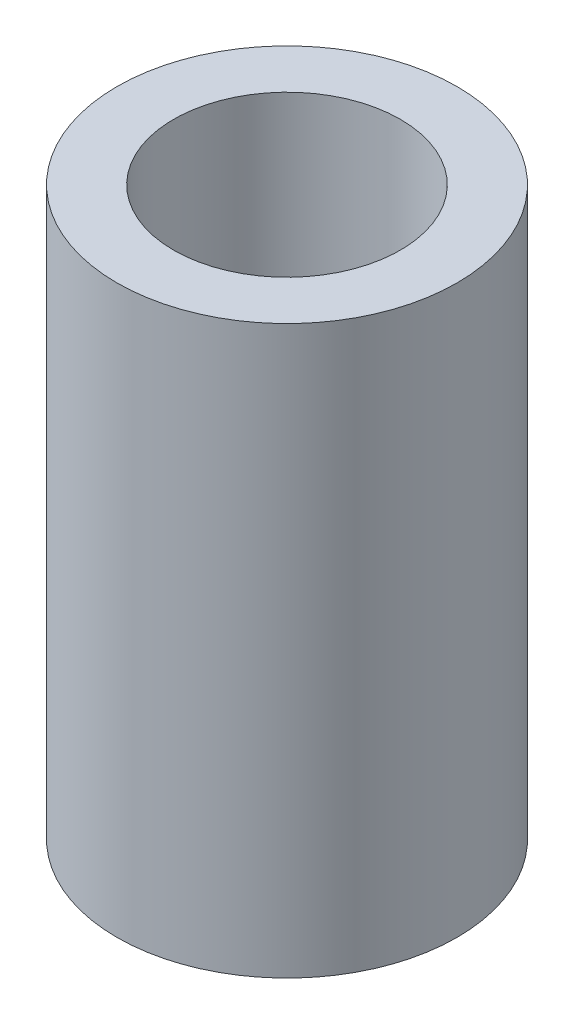
ISO-10303-21;
HEADER;
FILE_DESCRIPTION(('STEP AP214'),'2;1');
FILE_NAME('part.step','',(''),(''),'','','');
FILE_SCHEMA(('AUTOMOTIVE_DESIGN { 1 0 10303 214 1 1 1 1 }'));
ENDSEC;
DATA;
#1=APPLICATION_CONTEXT('core data for automotive mechanical design processes');
#2=APPLICATION_PROTOCOL_DEFINITION('international standard','automotive_design',2000,#1);
#3=PRODUCT_CONTEXT('',#1,'mechanical');
#4=PRODUCT('Part','Part','',(#3));
#5=PRODUCT_RELATED_PRODUCT_CATEGORY('part','',(#4));
#6=PRODUCT_DEFINITION_FORMATION('','',#4);
#7=PRODUCT_DEFINITION_CONTEXT('part definition',#1,'design');
#8=PRODUCT_DEFINITION('design','',#6,#7);
#9=PRODUCT_DEFINITION_SHAPE('','',#8);
#10=(LENGTH_UNIT() NAMED_UNIT(*) SI_UNIT(.MILLI.,.METRE.));
#11=(NAMED_UNIT(*) PLANE_ANGLE_UNIT() SI_UNIT($,.RADIAN.));
#12=(NAMED_UNIT(*) SI_UNIT($,.STERADIAN.) SOLID_ANGLE_UNIT());
#13=UNCERTAINTY_MEASURE_WITH_UNIT(LENGTH_MEASURE(1.E-05),#10,'distance_accuracy_value','');
#14=(GEOMETRIC_REPRESENTATION_CONTEXT(3) GLOBAL_UNCERTAINTY_ASSIGNED_CONTEXT((#13)) GLOBAL_UNIT_ASSIGNED_CONTEXT((#10,
#11,#12)) REPRESENTATION_CONTEXT('',''));
#15=CARTESIAN_POINT('',(0.,0.,0.));
#16=DIRECTION('',(0.,0.,1.));
#17=DIRECTION('',(1.,0.,0.));
#18=AXIS2_PLACEMENT_3D('',#15,#16,#17);
#19=CARTESIAN_POINT('',(0.,5.,0.));
#20=DIRECTION('',(0.,1.,0.));
#21=DIRECTION('',(0.,0.,1.));
#22=AXIS2_PLACEMENT_3D('',#19,#20,#21);
#23=PLANE('',#22);
#24=CARTESIAN_POINT('',(0.,5.,0.));
#25=DIRECTION('',(0.,1.,0.));
#26=DIRECTION('',(0.,0.,1.));
#27=AXIS2_PLACEMENT_3D('',#24,#25,#26);
#28=CIRCLE('',#27,1.5);
#29=CARTESIAN_POINT('',(0.,5.,1.5));
#30=VERTEX_POINT('',#29);
#31=EDGE_CURVE('E10',#30,#30,#28,.T.);
#32=ORIENTED_EDGE('',*,*,#31,.T.);
#33=EDGE_LOOP('',(#32));
#34=FACE_BOUND('',#33,.T.);
#35=CARTESIAN_POINT('',(0.,5.,0.));
#36=DIRECTION('',(0.,1.,0.));
#37=DIRECTION('',(0.,0.,1.));
#38=AXIS2_PLACEMENT_3D('',#35,#36,#37);
#39=CIRCLE('',#38,1.);
#40=CARTESIAN_POINT('',(0.,5.,1.));
#41=VERTEX_POINT('',#40);
#42=EDGE_CURVE('E55',#41,#41,#39,.T.);
#43=ORIENTED_EDGE('',*,*,#42,.F.);
#44=EDGE_LOOP('',(#43));
#45=FACE_BOUND('',#44,.T.);
#46=ADVANCED_FACE('F41',(#34,#45),#23,.T.);
#47=CARTESIAN_POINT('',(0.,0.,0.));
#48=DIRECTION('',(0.,1.,0.));
#49=DIRECTION('',(0.,0.,1.));
#50=AXIS2_PLACEMENT_3D('',#47,#48,#49);
#51=PLANE('',#50);
#52=CARTESIAN_POINT('',(0.,0.,0.));
#53=DIRECTION('',(0.,1.,0.));
#54=DIRECTION('',(0.,0.,1.));
#55=AXIS2_PLACEMENT_3D('',#52,#53,#54);
#56=CIRCLE('',#55,1.5);
#57=CARTESIAN_POINT('',(0.,0.,1.5));
#58=VERTEX_POINT('',#57);
#59=EDGE_CURVE('E45',#58,#58,#56,.T.);
#60=ORIENTED_EDGE('',*,*,#59,.F.);
#61=EDGE_LOOP('',(#60));
#62=FACE_BOUND('',#61,.T.);
#63=CARTESIAN_POINT('',(0.,0.,0.));
#64=DIRECTION('',(0.,1.,0.));
#65=DIRECTION('',(0.,0.,1.));
#66=AXIS2_PLACEMENT_3D('',#63,#64,#65);
#67=CIRCLE('',#66,1.);
#68=CARTESIAN_POINT('',(0.,0.,1.));
#69=VERTEX_POINT('',#68);
#70=EDGE_CURVE('E57',#69,#69,#67,.T.);
#71=ORIENTED_EDGE('',*,*,#70,.T.);
#72=EDGE_LOOP('',(#71));
#73=FACE_BOUND('',#72,.T.);
#74=ADVANCED_FACE('F68',(#62,#73),#51,.F.);
#75=CARTESIAN_POINT('',(0.,5.,0.));
#76=DIRECTION('',(0.,-1.,0.));
#77=DIRECTION('',(0.,0.,-1.));
#78=AXIS2_PLACEMENT_3D('',#75,#76,#77);
#79=CYLINDRICAL_SURFACE('',#78,1.5);
#80=ORIENTED_EDGE('',*,*,#31,.F.);
#81=EDGE_LOOP('',(#80));
#82=FACE_BOUND('',#81,.T.);
#83=ORIENTED_EDGE('',*,*,#59,.T.);
#84=EDGE_LOOP('',(#83));
#85=FACE_BOUND('',#84,.T.);
#86=ADVANCED_FACE('F43',(#82,#85),#79,.T.);
#87=CARTESIAN_POINT('',(0.,5.,0.));
#88=DIRECTION('',(0.,-1.,0.));
#89=DIRECTION('',(0.,0.,-1.));
#90=AXIS2_PLACEMENT_3D('',#87,#88,#89);
#91=CYLINDRICAL_SURFACE('',#90,1.);
#92=ORIENTED_EDGE('',*,*,#42,.T.);
#93=EDGE_LOOP('',(#92));
#94=FACE_BOUND('',#93,.T.);
#95=ORIENTED_EDGE('',*,*,#70,.F.);
#96=EDGE_LOOP('',(#95));
#97=FACE_BOUND('',#96,.T.);
#98=ADVANCED_FACE('F64',(#94,#97),#91,.F.);
#99=CLOSED_SHELL('',(#46,#74,#86,#98));
#100=MANIFOLD_SOLID_BREP('B2',#99);
#101=ADVANCED_BREP_SHAPE_REPRESENTATION('',(#18,#100),#14);
#102=SHAPE_DEFINITION_REPRESENTATION(#9,#101);
ENDSEC;
END-ISO-10303-21;
